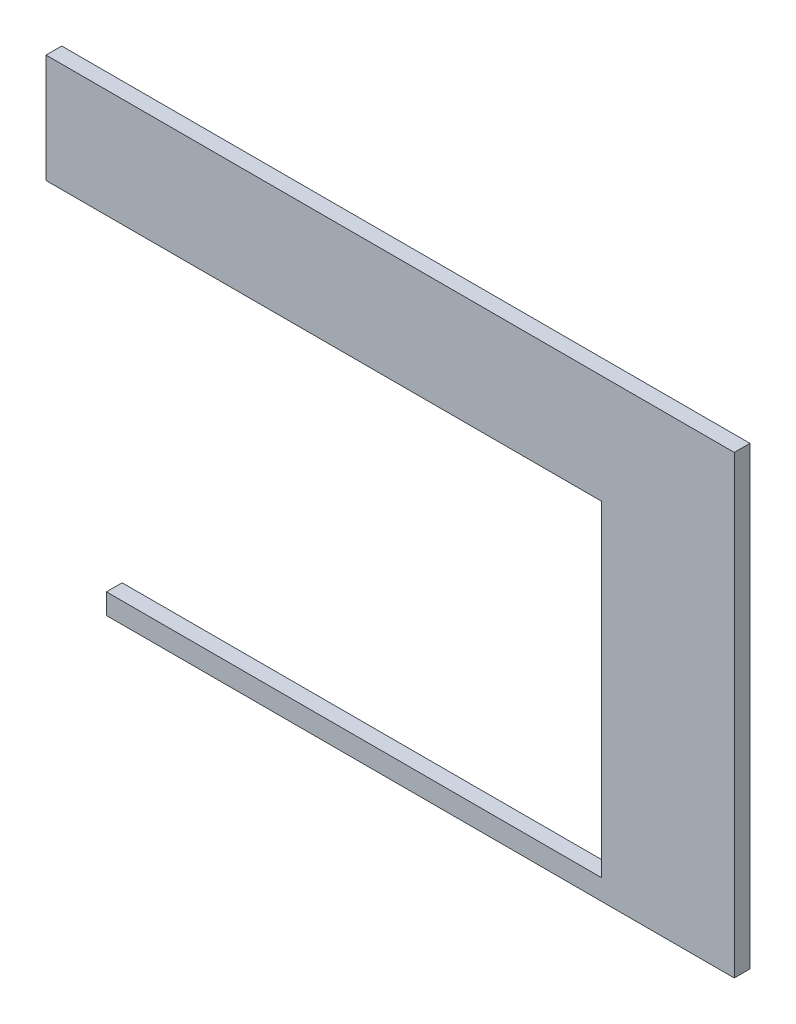
ISO-10303-21;
HEADER;
FILE_DESCRIPTION(('STEP AP214'),'2;1');
FILE_NAME('part.step','',(''),(''),'','','');
FILE_SCHEMA(('AUTOMOTIVE_DESIGN { 1 0 10303 214 1 1 1 1 }'));
ENDSEC;
DATA;
#1=APPLICATION_CONTEXT('core data for automotive mechanical design processes');
#2=APPLICATION_PROTOCOL_DEFINITION('international standard','automotive_design',2000,#1);
#3=PRODUCT_CONTEXT('',#1,'mechanical');
#4=PRODUCT('Part','Part','',(#3));
#5=PRODUCT_RELATED_PRODUCT_CATEGORY('part','',(#4));
#6=PRODUCT_DEFINITION_FORMATION('','',#4);
#7=PRODUCT_DEFINITION_CONTEXT('part definition',#1,'design');
#8=PRODUCT_DEFINITION('design','',#6,#7);
#9=PRODUCT_DEFINITION_SHAPE('','',#8);
#10=(LENGTH_UNIT() NAMED_UNIT(*) SI_UNIT(.MILLI.,.METRE.));
#11=(NAMED_UNIT(*) PLANE_ANGLE_UNIT() SI_UNIT($,.RADIAN.));
#12=(NAMED_UNIT(*) SI_UNIT($,.STERADIAN.) SOLID_ANGLE_UNIT());
#13=UNCERTAINTY_MEASURE_WITH_UNIT(LENGTH_MEASURE(1.E-05),#10,'distance_accuracy_value','');
#14=(GEOMETRIC_REPRESENTATION_CONTEXT(3) GLOBAL_UNCERTAINTY_ASSIGNED_CONTEXT((#13)) GLOBAL_UNIT_ASSIGNED_CONTEXT((#10,
#11,#12)) REPRESENTATION_CONTEXT('',''));
#15=CARTESIAN_POINT('',(0.,0.,0.));
#16=DIRECTION('',(0.,0.,1.));
#17=DIRECTION('',(1.,0.,0.));
#18=AXIS2_PLACEMENT_3D('',#15,#16,#17);
#19=CARTESIAN_POINT('',(10.3846153846154,15.,0.5));
#20=DIRECTION('',(-1.,0.,0.));
#21=DIRECTION('',(0.,0.,1.));
#22=AXIS2_PLACEMENT_3D('',#19,#20,#21);
#23=PLANE('',#22);
#24=DIRECTION('',(0.,-1.,0.));
#25=VECTOR('',#24,1.);
#26=CARTESIAN_POINT('',(10.3846153846154,15.,1.));
#27=LINE('',#26,#25);
#28=CARTESIAN_POINT('',(10.3846153846154,15.,1.));
#29=VERTEX_POINT('',#28);
#30=CARTESIAN_POINT('',(10.3846153846154,0.5,1.));
#31=VERTEX_POINT('',#30);
#32=EDGE_CURVE('E43',#29,#31,#27,.T.);
#33=ORIENTED_EDGE('',*,*,#32,.T.);
#34=DIRECTION('',(0.,0.,-1.));
#35=VECTOR('',#34,1.);
#36=CARTESIAN_POINT('',(10.3846153846154,0.5,0.5));
#37=LINE('',#36,#35);
#38=CARTESIAN_POINT('',(10.3846153846154,0.5,0.5));
#39=VERTEX_POINT('',#38);
#40=EDGE_CURVE('E57',#31,#39,#37,.T.);
#41=ORIENTED_EDGE('',*,*,#40,.T.);
#42=DIRECTION('',(0.,-1.,0.));
#43=VECTOR('',#42,1.);
#44=CARTESIAN_POINT('',(10.3846153846154,15.,0.5));
#45=LINE('',#44,#43);
#46=CARTESIAN_POINT('',(10.3846153846154,15.,0.5));
#47=VERTEX_POINT('',#46);
#48=EDGE_CURVE('E109',#47,#39,#45,.T.);
#49=ORIENTED_EDGE('',*,*,#48,.F.);
#50=DIRECTION('',(0.,0.,1.));
#51=VECTOR('',#50,1.);
#52=CARTESIAN_POINT('',(10.3846153846154,15.,0.5));
#53=LINE('',#52,#51);
#54=EDGE_CURVE('E117',#47,#29,#53,.T.);
#55=ORIENTED_EDGE('',*,*,#54,.T.);
#56=EDGE_LOOP('',(#33,#41,#49,#55));
#57=FACE_BOUND('',#56,.T.);
#58=ADVANCED_FACE('F39',(#57),#23,.F.);
#59=CARTESIAN_POINT('',(-9.61538461538462,-2.30769230769231,0.5));
#60=DIRECTION('',(1.,0.,0.));
#61=DIRECTION('',(0.,0.,-1.));
#62=AXIS2_PLACEMENT_3D('',#59,#60,#61);
#63=PLANE('',#62);
#64=DIRECTION('',(0.,1.,0.));
#65=VECTOR('',#64,1.);
#66=CARTESIAN_POINT('',(-9.61538461538462,-2.30769230769231,0.5));
#67=LINE('',#66,#65);
#68=CARTESIAN_POINT('',(-9.61538461538462,0.5,0.5));
#69=VERTEX_POINT('',#68);
#70=CARTESIAN_POINT('',(-9.61538461538462,1.15384615384615,0.5));
#71=VERTEX_POINT('',#70);
#72=EDGE_CURVE('E113',#69,#71,#67,.T.);
#73=ORIENTED_EDGE('',*,*,#72,.F.);
#74=DIRECTION('',(0.,0.,1.));
#75=VECTOR('',#74,1.);
#76=CARTESIAN_POINT('',(-9.61538461538462,0.5,0.5));
#77=LINE('',#76,#75);
#78=CARTESIAN_POINT('',(-9.61538461538462,0.5,1.));
#79=VERTEX_POINT('',#78);
#80=EDGE_CURVE('E98',#69,#79,#77,.T.);
#81=ORIENTED_EDGE('',*,*,#80,.T.);
#82=DIRECTION('',(0.,1.,0.));
#83=VECTOR('',#82,1.);
#84=CARTESIAN_POINT('',(-9.61538461538462,-2.30769230769231,1.));
#85=LINE('',#84,#83);
#86=CARTESIAN_POINT('',(-9.61538461538462,1.15384615384615,1.));
#87=VERTEX_POINT('',#86);
#88=EDGE_CURVE('E111',#79,#87,#85,.T.);
#89=ORIENTED_EDGE('',*,*,#88,.T.);
#90=DIRECTION('',(0.,0.,1.));
#91=VECTOR('',#90,1.);
#92=CARTESIAN_POINT('',(-9.61538461538462,1.15384615384615,0.5));
#93=LINE('',#92,#91);
#94=EDGE_CURVE('E141',#71,#87,#93,.T.);
#95=ORIENTED_EDGE('',*,*,#94,.F.);
#96=EDGE_LOOP('',(#73,#81,#89,#95));
#97=FACE_BOUND('',#96,.T.);
#98=ADVANCED_FACE('F112',(#97),#63,.F.);
#99=CARTESIAN_POINT('',(0.,0.,0.5));
#100=DIRECTION('',(0.,0.,-1.));
#101=DIRECTION('',(-1.,0.,0.));
#102=AXIS2_PLACEMENT_3D('',#99,#100,#101);
#103=PLANE('',#102);
#104=DIRECTION('',(1.,0.,0.));
#105=VECTOR('',#104,1.);
#106=CARTESIAN_POINT('',(0.,0.5,0.5));
#107=LINE('',#106,#105);
#108=EDGE_CURVE('E11',#69,#39,#107,.T.);
#109=ORIENTED_EDGE('',*,*,#108,.F.);
#110=ORIENTED_EDGE('',*,*,#72,.T.);
#111=DIRECTION('',(1.,0.,0.));
#112=VECTOR('',#111,1.);
#113=CARTESIAN_POINT('',(-9.61538461538462,1.15384615384615,0.5));
#114=LINE('',#113,#112);
#115=CARTESIAN_POINT('',(6.15384615384615,1.15384615384615,0.5));
#116=VERTEX_POINT('',#115);
#117=EDGE_CURVE('E123',#71,#116,#114,.T.);
#118=ORIENTED_EDGE('',*,*,#117,.T.);
#119=DIRECTION('',(0.,1.,0.));
#120=VECTOR('',#119,1.);
#121=CARTESIAN_POINT('',(6.15384615384615,1.15384615384615,0.5));
#122=LINE('',#121,#120);
#123=CARTESIAN_POINT('',(6.15384615384615,11.5384615384615,0.5));
#124=VERTEX_POINT('',#123);
#125=EDGE_CURVE('E135',#116,#124,#122,.T.);
#126=ORIENTED_EDGE('',*,*,#125,.T.);
#127=DIRECTION('',(-1.,0.,0.));
#128=VECTOR('',#127,1.);
#129=CARTESIAN_POINT('',(6.15384615384615,11.5384615384615,0.5));
#130=LINE('',#129,#128);
#131=CARTESIAN_POINT('',(-11.5384615384615,11.5384615384615,0.5));
#132=VERTEX_POINT('',#131);
#133=EDGE_CURVE('E132',#124,#132,#130,.T.);
#134=ORIENTED_EDGE('',*,*,#133,.T.);
#135=DIRECTION('',(0.,1.,0.));
#136=VECTOR('',#135,1.);
#137=CARTESIAN_POINT('',(-11.5384615384615,11.5384615384615,0.5));
#138=LINE('',#137,#136);
#139=CARTESIAN_POINT('',(-11.5384615384615,15.,0.5));
#140=VERTEX_POINT('',#139);
#141=EDGE_CURVE('E127',#132,#140,#138,.T.);
#142=ORIENTED_EDGE('',*,*,#141,.T.);
#143=DIRECTION('',(1.,0.,0.));
#144=VECTOR('',#143,1.);
#145=CARTESIAN_POINT('',(-11.5384615384615,15.,0.5));
#146=LINE('',#145,#144);
#147=EDGE_CURVE('E124',#140,#47,#146,.T.);
#148=ORIENTED_EDGE('',*,*,#147,.T.);
#149=ORIENTED_EDGE('',*,*,#48,.T.);
#150=EDGE_LOOP('',(#109,#110,#118,#126,#134,#142,#148,#149));
#151=FACE_BOUND('',#150,.T.);
#152=ADVANCED_FACE('F184',(#151),#103,.T.);
#153=CARTESIAN_POINT('',(0.,0.,1.));
#154=DIRECTION('',(0.,0.,-1.));
#155=DIRECTION('',(-1.,0.,0.));
#156=AXIS2_PLACEMENT_3D('',#153,#154,#155);
#157=PLANE('',#156);
#158=ORIENTED_EDGE('',*,*,#88,.F.);
#159=DIRECTION('',(1.,0.,0.));
#160=VECTOR('',#159,1.);
#161=CARTESIAN_POINT('',(-17.,0.5,1.));
#162=LINE('',#161,#160);
#163=EDGE_CURVE('E102',#79,#31,#162,.T.);
#164=ORIENTED_EDGE('',*,*,#163,.T.);
#165=ORIENTED_EDGE('',*,*,#32,.F.);
#166=DIRECTION('',(1.,0.,0.));
#167=VECTOR('',#166,1.);
#168=CARTESIAN_POINT('',(-11.5384615384615,15.,1.));
#169=LINE('',#168,#167);
#170=CARTESIAN_POINT('',(-11.5384615384615,15.,1.));
#171=VERTEX_POINT('',#170);
#172=EDGE_CURVE('E107',#171,#29,#169,.T.);
#173=ORIENTED_EDGE('',*,*,#172,.F.);
#174=DIRECTION('',(0.,1.,0.));
#175=VECTOR('',#174,1.);
#176=CARTESIAN_POINT('',(-11.5384615384615,11.5384615384615,1.));
#177=LINE('',#176,#175);
#178=CARTESIAN_POINT('',(-11.5384615384615,11.5384615384615,1.));
#179=VERTEX_POINT('',#178);
#180=EDGE_CURVE('E149',#179,#171,#177,.T.);
#181=ORIENTED_EDGE('',*,*,#180,.F.);
#182=DIRECTION('',(-1.,0.,0.));
#183=VECTOR('',#182,1.);
#184=CARTESIAN_POINT('',(6.15384615384615,11.5384615384615,1.));
#185=LINE('',#184,#183);
#186=CARTESIAN_POINT('',(6.15384615384615,11.5384615384615,1.));
#187=VERTEX_POINT('',#186);
#188=EDGE_CURVE('E144',#187,#179,#185,.T.);
#189=ORIENTED_EDGE('',*,*,#188,.F.);
#190=DIRECTION('',(0.,1.,0.));
#191=VECTOR('',#190,1.);
#192=CARTESIAN_POINT('',(6.15384615384615,1.15384615384615,1.));
#193=LINE('',#192,#191);
#194=CARTESIAN_POINT('',(6.15384615384615,1.15384615384615,1.));
#195=VERTEX_POINT('',#194);
#196=EDGE_CURVE('E145',#195,#187,#193,.T.);
#197=ORIENTED_EDGE('',*,*,#196,.F.);
#198=DIRECTION('',(1.,0.,0.));
#199=VECTOR('',#198,1.);
#200=CARTESIAN_POINT('',(-9.61538461538462,1.15384615384615,1.));
#201=LINE('',#200,#199);
#202=EDGE_CURVE('E118',#87,#195,#201,.T.);
#203=ORIENTED_EDGE('',*,*,#202,.F.);
#204=EDGE_LOOP('',(#158,#164,#165,#173,#181,#189,#197,#203));
#205=FACE_BOUND('',#204,.T.);
#206=ADVANCED_FACE('F41',(#205),#157,.F.);
#207=CARTESIAN_POINT('',(-11.5384615384615,15.,0.5));
#208=DIRECTION('',(0.,-1.,0.));
#209=DIRECTION('',(0.,0.,-1.));
#210=AXIS2_PLACEMENT_3D('',#207,#208,#209);
#211=PLANE('',#210);
#212=ORIENTED_EDGE('',*,*,#172,.T.);
#213=ORIENTED_EDGE('',*,*,#54,.F.);
#214=ORIENTED_EDGE('',*,*,#147,.F.);
#215=DIRECTION('',(0.,0.,1.));
#216=VECTOR('',#215,1.);
#217=CARTESIAN_POINT('',(-11.5384615384615,15.,0.5));
#218=LINE('',#217,#216);
#219=EDGE_CURVE('E137',#140,#171,#218,.T.);
#220=ORIENTED_EDGE('',*,*,#219,.T.);
#221=EDGE_LOOP('',(#212,#213,#214,#220));
#222=FACE_BOUND('',#221,.T.);
#223=ADVANCED_FACE('F163',(#222),#211,.F.);
#224=CARTESIAN_POINT('',(-9.61538461538462,1.15384615384615,0.5));
#225=DIRECTION('',(0.,-1.,0.));
#226=DIRECTION('',(0.,0.,-1.));
#227=AXIS2_PLACEMENT_3D('',#224,#225,#226);
#228=PLANE('',#227);
#229=ORIENTED_EDGE('',*,*,#202,.T.);
#230=DIRECTION('',(0.,0.,1.));
#231=VECTOR('',#230,1.);
#232=CARTESIAN_POINT('',(6.15384615384615,1.15384615384615,0.5));
#233=LINE('',#232,#231);
#234=EDGE_CURVE('E143',#116,#195,#233,.T.);
#235=ORIENTED_EDGE('',*,*,#234,.F.);
#236=ORIENTED_EDGE('',*,*,#117,.F.);
#237=ORIENTED_EDGE('',*,*,#94,.T.);
#238=EDGE_LOOP('',(#229,#235,#236,#237));
#239=FACE_BOUND('',#238,.T.);
#240=ADVANCED_FACE('F183',(#239),#228,.F.);
#241=CARTESIAN_POINT('',(6.15384615384615,1.15384615384615,0.5));
#242=DIRECTION('',(1.,0.,0.));
#243=DIRECTION('',(0.,0.,-1.));
#244=AXIS2_PLACEMENT_3D('',#241,#242,#243);
#245=PLANE('',#244);
#246=ORIENTED_EDGE('',*,*,#196,.T.);
#247=DIRECTION('',(0.,0.,1.));
#248=VECTOR('',#247,1.);
#249=CARTESIAN_POINT('',(6.15384615384615,11.5384615384615,0.5));
#250=LINE('',#249,#248);
#251=EDGE_CURVE('E150',#124,#187,#250,.T.);
#252=ORIENTED_EDGE('',*,*,#251,.F.);
#253=ORIENTED_EDGE('',*,*,#125,.F.);
#254=ORIENTED_EDGE('',*,*,#234,.T.);
#255=EDGE_LOOP('',(#246,#252,#253,#254));
#256=FACE_BOUND('',#255,.T.);
#257=ADVANCED_FACE('F177',(#256),#245,.F.);
#258=CARTESIAN_POINT('',(6.15384615384615,11.5384615384615,0.5));
#259=DIRECTION('',(0.,1.,0.));
#260=DIRECTION('',(0.,0.,1.));
#261=AXIS2_PLACEMENT_3D('',#258,#259,#260);
#262=PLANE('',#261);
#263=ORIENTED_EDGE('',*,*,#188,.T.);
#264=DIRECTION('',(0.,0.,1.));
#265=VECTOR('',#264,1.);
#266=CARTESIAN_POINT('',(-11.5384615384615,11.5384615384615,0.5));
#267=LINE('',#266,#265);
#268=EDGE_CURVE('E47',#132,#179,#267,.T.);
#269=ORIENTED_EDGE('',*,*,#268,.F.);
#270=ORIENTED_EDGE('',*,*,#133,.F.);
#271=ORIENTED_EDGE('',*,*,#251,.T.);
#272=EDGE_LOOP('',(#263,#269,#270,#271));
#273=FACE_BOUND('',#272,.T.);
#274=ADVANCED_FACE('F172',(#273),#262,.F.);
#275=CARTESIAN_POINT('',(-11.5384615384615,11.5384615384615,0.5));
#276=DIRECTION('',(1.,0.,0.));
#277=DIRECTION('',(0.,0.,-1.));
#278=AXIS2_PLACEMENT_3D('',#275,#276,#277);
#279=PLANE('',#278);
#280=ORIENTED_EDGE('',*,*,#180,.T.);
#281=ORIENTED_EDGE('',*,*,#219,.F.);
#282=ORIENTED_EDGE('',*,*,#141,.F.);
#283=ORIENTED_EDGE('',*,*,#268,.T.);
#284=EDGE_LOOP('',(#280,#281,#282,#283));
#285=FACE_BOUND('',#284,.T.);
#286=ADVANCED_FACE('F169',(#285),#279,.F.);
#287=CARTESIAN_POINT('',(-17.,0.5,1.));
#288=DIRECTION('',(0.,1.,0.));
#289=DIRECTION('',(0.,0.,1.));
#290=AXIS2_PLACEMENT_3D('',#287,#288,#289);
#291=PLANE('',#290);
#292=ORIENTED_EDGE('',*,*,#163,.F.);
#293=ORIENTED_EDGE('',*,*,#80,.F.);
#294=ORIENTED_EDGE('',*,*,#108,.T.);
#295=ORIENTED_EDGE('',*,*,#40,.F.);
#296=EDGE_LOOP('',(#292,#293,#294,#295));
#297=FACE_BOUND('',#296,.T.);
#298=ADVANCED_FACE('F105',(#297),#291,.F.);
#299=CLOSED_SHELL('',(#58,#98,#152,#206,#223,#240,#257,#274,#286,#298));
#300=MANIFOLD_SOLID_BREP('B2',#299);
#301=ADVANCED_BREP_SHAPE_REPRESENTATION('',(#18,#300),#14);
#302=SHAPE_DEFINITION_REPRESENTATION(#9,#301);
ENDSEC;
END-ISO-10303-21;
